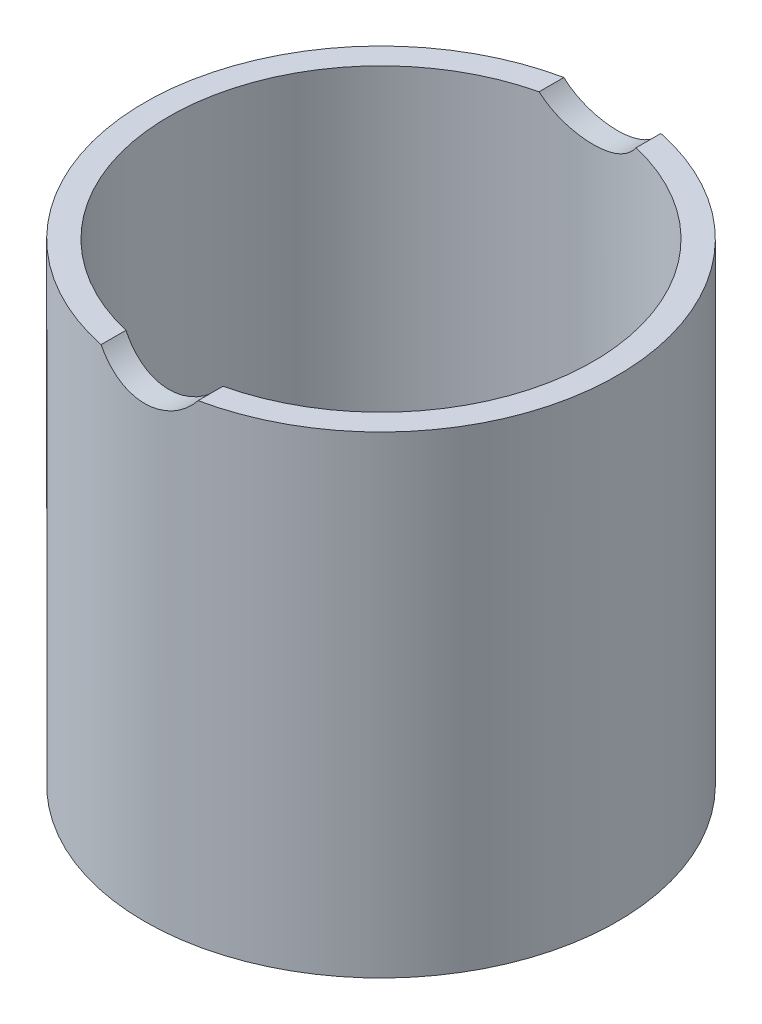
ISO-10303-21;
HEADER;
FILE_DESCRIPTION(('STEP AP214'),'2;1');
FILE_NAME('part.step','',(''),(''),'','','');
FILE_SCHEMA(('AUTOMOTIVE_DESIGN { 1 0 10303 214 1 1 1 1 }'));
ENDSEC;
DATA;
#1=APPLICATION_CONTEXT('core data for automotive mechanical design processes');
#2=APPLICATION_PROTOCOL_DEFINITION('international standard','automotive_design',2000,#1);
#3=PRODUCT_CONTEXT('',#1,'mechanical');
#4=PRODUCT('Part','Part','',(#3));
#5=PRODUCT_RELATED_PRODUCT_CATEGORY('part','',(#4));
#6=PRODUCT_DEFINITION_FORMATION('','',#4);
#7=PRODUCT_DEFINITION_CONTEXT('part definition',#1,'design');
#8=PRODUCT_DEFINITION('design','',#6,#7);
#9=PRODUCT_DEFINITION_SHAPE('','',#8);
#10=(LENGTH_UNIT() NAMED_UNIT(*) SI_UNIT(.MILLI.,.METRE.));
#11=(NAMED_UNIT(*) PLANE_ANGLE_UNIT() SI_UNIT($,.RADIAN.));
#12=(NAMED_UNIT(*) SI_UNIT($,.STERADIAN.) SOLID_ANGLE_UNIT());
#13=UNCERTAINTY_MEASURE_WITH_UNIT(LENGTH_MEASURE(1.E-05),#10,'distance_accuracy_value','');
#14=(GEOMETRIC_REPRESENTATION_CONTEXT(3) GLOBAL_UNCERTAINTY_ASSIGNED_CONTEXT((#13)) GLOBAL_UNIT_ASSIGNED_CONTEXT((#10,
#11,#12)) REPRESENTATION_CONTEXT('',''));
#15=CARTESIAN_POINT('',(0.,0.,0.));
#16=DIRECTION('',(0.,0.,1.));
#17=DIRECTION('',(1.,0.,0.));
#18=AXIS2_PLACEMENT_3D('',#15,#16,#17);
#19=CARTESIAN_POINT('',(0.,37.,0.));
#20=DIRECTION('',(0.,1.,0.));
#21=DIRECTION('',(0.,0.,1.));
#22=AXIS2_PLACEMENT_3D('',#19,#20,#21);
#23=PLANE('',#22);
#24=DIRECTION('',(0.,0.,1.));
#25=VECTOR('',#24,1.);
#26=CARTESIAN_POINT('',(-4.,37.,-19.5));
#27=LINE('',#26,#25);
#28=CARTESIAN_POINT('',(-4.,37.,-19.0853346839923));
#29=VERTEX_POINT('',#28);
#30=CARTESIAN_POINT('',(-4.,37.,-17.0367250374008));
#31=VERTEX_POINT('',#30);
#32=EDGE_CURVE('E62',#29,#31,#27,.T.);
#33=ORIENTED_EDGE('',*,*,#32,.F.);
#34=CARTESIAN_POINT('',(0.,37.,0.));
#35=DIRECTION('',(0.,1.,0.));
#36=DIRECTION('',(0.,0.,1.));
#37=AXIS2_PLACEMENT_3D('',#34,#35,#36);
#38=CIRCLE('',#37,19.5);
#39=CARTESIAN_POINT('',(-4.,37.,19.0853346839923));
#40=VERTEX_POINT('',#39);
#41=EDGE_CURVE('E105',#29,#40,#38,.T.);
#42=ORIENTED_EDGE('',*,*,#41,.T.);
#43=CARTESIAN_POINT('',(-4.,37.,17.0367250374008));
#44=VERTEX_POINT('',#43);
#45=EDGE_CURVE('E147',#44,#40,#27,.T.);
#46=ORIENTED_EDGE('',*,*,#45,.F.);
#47=CARTESIAN_POINT('',(0.,37.,0.));
#48=DIRECTION('',(0.,1.,0.));
#49=DIRECTION('',(0.,0.,1.));
#50=AXIS2_PLACEMENT_3D('',#47,#48,#49);
#51=CIRCLE('',#50,17.5);
#52=EDGE_CURVE('E106',#31,#44,#51,.T.);
#53=ORIENTED_EDGE('',*,*,#52,.F.);
#54=EDGE_LOOP('',(#33,#42,#46,#53));
#55=FACE_BOUND('',#54,.T.);
#56=ADVANCED_FACE('F39',(#55),#23,.T.);
#57=DIRECTION('',(0.,0.,1.));
#58=VECTOR('',#57,1.);
#59=CARTESIAN_POINT('',(4.,37.,-19.5));
#60=LINE('',#59,#58);
#61=CARTESIAN_POINT('',(4.,37.,19.0853346839923));
#62=VERTEX_POINT('',#61);
#63=CARTESIAN_POINT('',(4.,37.,17.0367250374008));
#64=VERTEX_POINT('',#63);
#65=EDGE_CURVE('E69',#62,#64,#60,.F.);
#66=ORIENTED_EDGE('',*,*,#65,.F.);
#67=CARTESIAN_POINT('',(4.,37.,-19.0853346839923));
#68=VERTEX_POINT('',#67);
#69=EDGE_CURVE('E94',#62,#68,#38,.T.);
#70=ORIENTED_EDGE('',*,*,#69,.T.);
#71=CARTESIAN_POINT('',(4.,37.,-17.0367250374008));
#72=VERTEX_POINT('',#71);
#73=EDGE_CURVE('E87',#72,#68,#60,.F.);
#74=ORIENTED_EDGE('',*,*,#73,.F.);
#75=EDGE_CURVE('E98',#64,#72,#51,.T.);
#76=ORIENTED_EDGE('',*,*,#75,.F.);
#77=EDGE_LOOP('',(#66,#70,#74,#76));
#78=FACE_BOUND('',#77,.T.);
#79=ADVANCED_FACE('F97',(#78),#23,.T.);
#80=CARTESIAN_POINT('',(0.,37.,0.));
#81=DIRECTION('',(0.,-1.,0.));
#82=DIRECTION('',(0.,0.,-1.));
#83=AXIS2_PLACEMENT_3D('',#80,#81,#82);
#84=CYLINDRICAL_SURFACE('',#83,19.5);
#85=ORIENTED_EDGE('',*,*,#69,.F.);
#86=CARTESIAN_POINT('',(4.,37.,19.0853346839923));
#87=CARTESIAN_POINT('',(3.91539894775833,36.887180005843,19.1030669430456));
#88=CARTESIAN_POINT('',(3.82604102713981,36.7779967337988,19.1212069531428));
#89=CARTESIAN_POINT('',(3.63845855582068,36.5675877414145,19.1577852748252));
#90=CARTESIAN_POINT('',(3.5402340828802,36.4663619513015,19.1762235837931));
#91=CARTESIAN_POINT('',(3.33552092436946,36.2725091357425,19.2128893661344));
#92=CARTESIAN_POINT('',(3.22902876900015,36.1798857567827,19.2311167472573));
#93=CARTESIAN_POINT('',(3.00852381599954,36.0039171020588,19.2668434292355));
#94=CARTESIAN_POINT('',(2.89451114468932,35.9205716705174,19.2843427423121));
#95=CARTESIAN_POINT('',(2.6596462795366,35.7637001404132,19.3181356147717));
#96=CARTESIAN_POINT('',(2.53878996285056,35.6901800525275,19.3344284333863));
#97=CARTESIAN_POINT('',(2.29106960070109,35.5535389675982,19.365344906995));
#98=CARTESIAN_POINT('',(2.16420335895805,35.4904218105596,19.3799679450186));
#99=CARTESIAN_POINT('',(1.9055042771648,35.3751663432857,19.4071108284061));
#100=CARTESIAN_POINT('',(1.77367625169066,35.323017698041,19.4196326513561));
#101=CARTESIAN_POINT('',(1.5058290948625,35.2300333403227,19.4422361236066));
#102=CARTESIAN_POINT('',(1.36980848126281,35.1892016810313,19.4523168984821));
#103=CARTESIAN_POINT('',(1.09689156804576,35.119802686935,19.4695971865778));
#104=CARTESIAN_POINT('',(0.960046711404564,35.0910441834348,19.4768414783258));
#105=CARTESIAN_POINT('',(0.684257723726504,35.0450690103063,19.4884798077338));
#106=CARTESIAN_POINT('',(0.545312836119357,35.0278566068344,19.4928727918477));
#107=CARTESIAN_POINT('',(0.266450925840192,35.0051458715094,19.4986780826447));
#108=CARTESIAN_POINT('',(0.12653422385814,34.9996438439155,19.5000913297178));
#109=CARTESIAN_POINT('',(-0.15331759407486,35.000392023477,19.4998994735274));
#110=CARTESIAN_POINT('',(-0.293252698157859,35.006646513713,19.4982932702315));
#111=CARTESIAN_POINT('',(-0.568598778598844,35.0305615124071,19.492182794488));
#112=CARTESIAN_POINT('',(-0.704036223140041,35.0479369445756,19.4877509652917));
#113=CARTESIAN_POINT('',(-0.972971800120385,35.0936836706468,19.4761765073741));
#114=CARTESIAN_POINT('',(-1.1064692073115,35.122058972251,19.4690328906577));
#115=CARTESIAN_POINT('',(-1.37051970547725,35.1895703736207,19.4522276995979));
#116=CARTESIAN_POINT('',(-1.50107359965313,35.2287034984693,19.4425668214044));
#117=CARTESIAN_POINT('',(-1.75840501498859,35.3174190335291,19.4209867885127));
#118=CARTESIAN_POINT('',(-1.88518116512297,35.3670051859009,19.4090668252219));
#119=CARTESIAN_POINT('',(-2.26051630269412,35.5317803583803,19.3701684494768));
#120=CARTESIAN_POINT('',(-2.50215016063253,35.6624903317992,19.340181018449));
#121=CARTESIAN_POINT('',(-2.96017235689538,35.9611720026755,19.2753991602963));
#122=CARTESIAN_POINT('',(-3.17657490974579,36.129122563673,19.2406074641138));
#123=CARTESIAN_POINT('',(-3.49185785247516,36.4179690027493,19.1851614477263));
#124=CARTESIAN_POINT('',(-3.60110428143892,36.527824022388,19.164896786588));
#125=CARTESIAN_POINT('',(-3.80877699730753,36.7569947049788,19.1247057123629));
#126=CARTESIAN_POINT('',(-3.90722342917271,36.8762920141025,19.1047787302355));
#127=CARTESIAN_POINT('',(-4.,37.,19.0853346839923));
#128=B_SPLINE_CURVE_WITH_KNOTS('',3,(#86,#87,#88,#89,#90,#91,#92,#93,#94,#95,#96,#97,#98,#99,
#100,#101,#102,#103,#104,#105,#106,#107,#108,#109,#110,#111,#112,#113,#114,#115,#116,#117,#118,
#119,#120,#121,#122,#123,#124,#125,#126,#127),.UNSPECIFIED.,.F.,.F.,(4,2,2,2,2,2,2,2,2,2,2,2,2,
2,2,2,2,2,2,2,4),(0.,0.426250026635663,0.852496315399733,1.27892246934025,1.70534146248273,
2.13202013584765,2.55885595688901,2.98528777486733,3.4118721227591,3.83142080794221,
4.25112442646869,4.67069556880661,5.09041959700064,5.49979321535186,5.90931612561346,
6.31872590208709,6.72828249601786,7.55331763757749,8.37788571109845,8.84603127885557,
9.31328822172199),.UNSPECIFIED.);
#129=EDGE_CURVE('E141',#62,#40,#128,.T.);
#130=ORIENTED_EDGE('',*,*,#129,.T.);
#131=ORIENTED_EDGE('',*,*,#41,.F.);
#132=CARTESIAN_POINT('',(-4.,37.,-19.0853346839923));
#133=CARTESIAN_POINT('',(-3.91539894775833,36.887180005843,-19.1030669430456));
#134=CARTESIAN_POINT('',(-3.82604102713981,36.7779967337988,-19.1212069531428));
#135=CARTESIAN_POINT('',(-3.63845855582068,36.5675877414145,-19.1577852748252));
#136=CARTESIAN_POINT('',(-3.5402340828802,36.4663619513015,-19.1762235837931));
#137=CARTESIAN_POINT('',(-3.33552092436946,36.2725091357425,-19.2128893661344));
#138=CARTESIAN_POINT('',(-3.22902876900015,36.1798857567827,-19.2311167472573));
#139=CARTESIAN_POINT('',(-3.00852381599954,36.0039171020588,-19.2668434292355));
#140=CARTESIAN_POINT('',(-2.89451114468932,35.9205716705174,-19.2843427423121));
#141=CARTESIAN_POINT('',(-2.6596462795366,35.7637001404132,-19.3181356147717));
#142=CARTESIAN_POINT('',(-2.53878996285056,35.6901800525275,-19.3344284333863));
#143=CARTESIAN_POINT('',(-2.29106960070109,35.5535389675982,-19.365344906995));
#144=CARTESIAN_POINT('',(-2.16420335895805,35.4904218105596,-19.3799679450186));
#145=CARTESIAN_POINT('',(-1.9055042771648,35.3751663432857,-19.4071108284061));
#146=CARTESIAN_POINT('',(-1.77367625169066,35.323017698041,-19.4196326513561));
#147=CARTESIAN_POINT('',(-1.5058290948625,35.2300333403227,-19.4422361236066));
#148=CARTESIAN_POINT('',(-1.36980848126281,35.1892016810313,-19.4523168984821));
#149=CARTESIAN_POINT('',(-1.09689156804576,35.119802686935,-19.4695971865778));
#150=CARTESIAN_POINT('',(-0.960046711404564,35.0910441834348,-19.4768414783258));
#151=CARTESIAN_POINT('',(-0.684257723726504,35.0450690103063,-19.4884798077338));
#152=CARTESIAN_POINT('',(-0.545312836119357,35.0278566068344,-19.4928727918477));
#153=CARTESIAN_POINT('',(-0.266450925840192,35.0051458715094,-19.4986780826447));
#154=CARTESIAN_POINT('',(-0.12653422385814,34.9996438439155,-19.5000913297178));
#155=CARTESIAN_POINT('',(0.15331759407486,35.000392023477,-19.4998994735274));
#156=CARTESIAN_POINT('',(0.293252698157859,35.006646513713,-19.4982932702315));
#157=CARTESIAN_POINT('',(0.568598778598844,35.0305615124071,-19.492182794488));
#158=CARTESIAN_POINT('',(0.704036223140041,35.0479369445756,-19.4877509652917));
#159=CARTESIAN_POINT('',(0.972971800120385,35.0936836706468,-19.4761765073741));
#160=CARTESIAN_POINT('',(1.1064692073115,35.122058972251,-19.4690328906577));
#161=CARTESIAN_POINT('',(1.37051970547725,35.1895703736207,-19.4522276995979));
#162=CARTESIAN_POINT('',(1.50107359965313,35.2287034984693,-19.4425668214044));
#163=CARTESIAN_POINT('',(1.75840501498859,35.3174190335291,-19.4209867885127));
#164=CARTESIAN_POINT('',(1.88518116512297,35.3670051859009,-19.4090668252219));
#165=CARTESIAN_POINT('',(2.26051630269412,35.5317803583803,-19.3701684494768));
#166=CARTESIAN_POINT('',(2.50215016063253,35.6624903317992,-19.340181018449));
#167=CARTESIAN_POINT('',(2.96017235689538,35.9611720026755,-19.2753991602963));
#168=CARTESIAN_POINT('',(3.17657490974579,36.129122563673,-19.2406074641138));
#169=CARTESIAN_POINT('',(3.49185785247516,36.4179690027493,-19.1851614477263));
#170=CARTESIAN_POINT('',(3.60110428143892,36.527824022388,-19.164896786588));
#171=CARTESIAN_POINT('',(3.80877699730753,36.7569947049788,-19.1247057123629));
#172=CARTESIAN_POINT('',(3.90722342917271,36.8762920141025,-19.1047787302355));
#173=CARTESIAN_POINT('',(4.,37.,-19.0853346839923));
#174=B_SPLINE_CURVE_WITH_KNOTS('',3,(#132,#133,#134,#135,#136,#137,#138,#139,#140,#141,#142,
#143,#144,#145,#146,#147,#148,#149,#150,#151,#152,#153,#154,#155,#156,#157,#158,#159,#160,#161,
#162,#163,#164,#165,#166,#167,#168,#169,#170,#171,#172,#173),.UNSPECIFIED.,.F.,.F.,(4,2,2,2,2,2,
2,2,2,2,2,2,2,2,2,2,2,2,2,2,4),(0.,0.426250026635663,0.852496315399733,1.27892246934025,
1.70534146248273,2.13202013584765,2.55885595688901,2.98528777486733,3.4118721227591,
3.83142080794221,4.25112442646869,4.67069556880661,5.09041959700064,5.49979321535186,
5.90931612561346,6.31872590208709,6.72828249601786,7.55331763757749,8.37788571109845,
8.84603127885557,9.31328822172199),.UNSPECIFIED.);
#175=EDGE_CURVE('E134',#29,#68,#174,.T.);
#176=ORIENTED_EDGE('',*,*,#175,.T.);
#177=EDGE_LOOP('',(#85,#130,#131,#176));
#178=FACE_BOUND('',#177,.T.);
#179=CARTESIAN_POINT('',(0.,-2.,0.));
#180=DIRECTION('',(0.,1.,0.));
#181=DIRECTION('',(0.,0.,1.));
#182=AXIS2_PLACEMENT_3D('',#179,#180,#181);
#183=CIRCLE('',#182,19.5);
#184=CARTESIAN_POINT('',(0.,-2.,19.5));
#185=VERTEX_POINT('',#184);
#186=EDGE_CURVE('E115',#185,#185,#183,.T.);
#187=ORIENTED_EDGE('',*,*,#186,.T.);
#188=EDGE_LOOP('',(#187));
#189=FACE_BOUND('',#188,.T.);
#190=ADVANCED_FACE('F41',(#178,#189),#84,.T.);
#191=CARTESIAN_POINT('',(0.,37.,0.));
#192=DIRECTION('',(0.,-1.,0.));
#193=DIRECTION('',(0.,0.,-1.));
#194=AXIS2_PLACEMENT_3D('',#191,#192,#193);
#195=CYLINDRICAL_SURFACE('',#194,17.5);
#196=CARTESIAN_POINT('',(4.,37.,17.0367250374008));
#197=CARTESIAN_POINT('',(3.91534408547769,36.887108519543,17.0566026049032));
#198=CARTESIAN_POINT('',(3.82593406738742,36.7778668956684,17.0769280252748));
#199=CARTESIAN_POINT('',(3.63824198187981,36.56735467786,17.1178972545212));
#200=CARTESIAN_POINT('',(3.53995989272078,36.466084103461,17.1385410641762));
#201=CARTESIAN_POINT('',(3.33508837845952,36.2721178210682,17.179584048879));
#202=CARTESIAN_POINT('',(3.22849317156432,36.1794281809118,17.199983042071));
#203=CARTESIAN_POINT('',(3.00775025327004,36.0033301094883,17.2399540651222));
#204=CARTESIAN_POINT('',(2.89360268114253,35.9199215071475,17.2595261102202));
#205=CARTESIAN_POINT('',(2.65841295642604,35.7629201818731,17.2973128997897));
#206=CARTESIAN_POINT('',(2.5373660511577,35.6893343449779,17.3155266881777));
#207=CARTESIAN_POINT('',(2.28920906510931,35.5525738166661,17.3500783497773));
#208=CARTESIAN_POINT('',(2.16209676849294,35.4894029682338,17.3664155298756));
#209=CARTESIAN_POINT('',(1.90285892247035,35.3740695046664,17.3967278155374));
#210=CARTESIAN_POINT('',(1.77073874271922,35.3218954714029,17.4107053680985));
#211=CARTESIAN_POINT('',(1.50225166976644,35.2288964262533,17.4359233606619));
#212=CARTESIAN_POINT('',(1.36588328706513,35.1880754459157,17.4471628281757));
#213=CARTESIAN_POINT('',(1.09278921402777,35.1188890103472,17.4663723349887));
#214=CARTESIAN_POINT('',(0.9561283220398,35.0902850735081,17.4744047519008));
#215=CARTESIAN_POINT('',(0.680693535465125,35.0445836952957,17.4873002152181));
#216=CARTESIAN_POINT('',(0.541918879639333,35.0274905045677,17.4921620907966));
#217=CARTESIAN_POINT('',(0.263395428208653,35.0049887972994,17.4985719522242));
#218=CARTESIAN_POINT('',(0.123646971726404,34.999576398822,17.5001210390276));
#219=CARTESIAN_POINT('',(-0.15586109794494,35.0004754886971,17.4998641359983));
#220=CARTESIAN_POINT('',(-0.295620696717879,35.00679124022,17.4980569261552));
#221=CARTESIAN_POINT('',(-0.569843611928941,35.0307296921787,17.4912412797191));
#222=CARTESIAN_POINT('',(-0.704339726904509,35.0480063464405,17.4863308331185));
#223=CARTESIAN_POINT('',(-0.971394117660786,35.0933976030916,17.4735306667096));
#224=CARTESIAN_POINT('',(-1.10395167318487,35.1215161325853,17.46563986739));
#225=CARTESIAN_POINT('',(-1.36613524242317,35.1883512246057,17.4470894822062));
#226=CARTESIAN_POINT('',(-1.49576207276449,35.2270647944906,17.4364306782272));
#227=CARTESIAN_POINT('',(-1.75126945544137,35.3147754334478,17.4126265010489));
#228=CARTESIAN_POINT('',(-1.87714864032039,35.3637762048961,17.3994802327769));
#229=CARTESIAN_POINT('',(-2.2502827124866,35.5267201840124,17.3565283937621));
#230=CARTESIAN_POINT('',(-2.49065460168873,35.6559962217144,17.3233868353747));
#231=CARTESIAN_POINT('',(-2.9464875983623,35.9512995262601,17.2517123626032));
#232=CARTESIAN_POINT('',(-3.16196070070729,36.1173089836473,17.2131820641604));
#233=CARTESIAN_POINT('',(-3.4795701672035,36.4058816482888,17.151002748727));
#234=CARTESIAN_POINT('',(-3.59160046279972,36.5178395143285,17.127821958019));
#235=CARTESIAN_POINT('',(-3.80437923808022,36.7516713240746,17.0818182672155));
#236=CARTESIAN_POINT('',(-3.90514897494327,36.8735258075326,17.0589947651988));
#237=CARTESIAN_POINT('',(-4.,37.,17.0367250374008));
#238=B_SPLINE_CURVE_WITH_KNOTS('',3,(#196,#197,#198,#199,#200,#201,#202,#203,#204,#205,#206,
#207,#208,#209,#210,#211,#212,#213,#214,#215,#216,#217,#218,#219,#220,#221,#222,#223,#224,#225,
#226,#227,#228,#229,#230,#231,#232,#233,#234,#235,#236,#237),.UNSPECIFIED.,.F.,.F.,(4,2,2,2,2,2,
2,2,2,2,2,2,2,2,2,2,2,2,2,2,4),(0.,0.427367943901694,0.854736935129296,1.28240585971255,
1.71006689994097,2.13802618567936,2.56614303066559,2.99381314268303,3.42163493000333,
3.84067453057113,4.25986878778439,4.67892371056639,5.09813098919158,5.50472067115337,
5.91145776510404,6.31808009173385,6.72484901386548,7.54568410308246,8.36612209558687,
8.84569116127194,9.32433905304124),.UNSPECIFIED.);
#239=EDGE_CURVE('E11',#64,#44,#238,.T.);
#240=ORIENTED_EDGE('',*,*,#239,.F.);
#241=ORIENTED_EDGE('',*,*,#75,.T.);
#242=CARTESIAN_POINT('',(-4.,37.,-17.0367250374008));
#243=CARTESIAN_POINT('',(-3.91534408547769,36.887108519543,-17.0566026049032));
#244=CARTESIAN_POINT('',(-3.82593406738742,36.7778668956684,-17.0769280252748));
#245=CARTESIAN_POINT('',(-3.63824198187981,36.56735467786,-17.1178972545212));
#246=CARTESIAN_POINT('',(-3.53995989272078,36.466084103461,-17.1385410641762));
#247=CARTESIAN_POINT('',(-3.33508837845952,36.2721178210682,-17.179584048879));
#248=CARTESIAN_POINT('',(-3.22849317156432,36.1794281809118,-17.199983042071));
#249=CARTESIAN_POINT('',(-3.00775025327004,36.0033301094883,-17.2399540651222));
#250=CARTESIAN_POINT('',(-2.89360268114253,35.9199215071475,-17.2595261102202));
#251=CARTESIAN_POINT('',(-2.65841295642604,35.7629201818731,-17.2973128997897));
#252=CARTESIAN_POINT('',(-2.5373660511577,35.6893343449779,-17.3155266881777));
#253=CARTESIAN_POINT('',(-2.28920906510931,35.5525738166661,-17.3500783497773));
#254=CARTESIAN_POINT('',(-2.16209676849294,35.4894029682338,-17.3664155298756));
#255=CARTESIAN_POINT('',(-1.90285892247035,35.3740695046664,-17.3967278155374));
#256=CARTESIAN_POINT('',(-1.77073874271922,35.3218954714029,-17.4107053680985));
#257=CARTESIAN_POINT('',(-1.50225166976644,35.2288964262533,-17.4359233606619));
#258=CARTESIAN_POINT('',(-1.36588328706513,35.1880754459157,-17.4471628281757));
#259=CARTESIAN_POINT('',(-1.09278921402777,35.1188890103472,-17.4663723349887));
#260=CARTESIAN_POINT('',(-0.9561283220398,35.0902850735081,-17.4744047519008));
#261=CARTESIAN_POINT('',(-0.680693535465125,35.0445836952957,-17.4873002152181));
#262=CARTESIAN_POINT('',(-0.541918879639333,35.0274905045677,-17.4921620907966));
#263=CARTESIAN_POINT('',(-0.263395428208653,35.0049887972994,-17.4985719522242));
#264=CARTESIAN_POINT('',(-0.123646971726404,34.999576398822,-17.5001210390276));
#265=CARTESIAN_POINT('',(0.15586109794494,35.0004754886971,-17.4998641359983));
#266=CARTESIAN_POINT('',(0.295620696717879,35.00679124022,-17.4980569261552));
#267=CARTESIAN_POINT('',(0.569843611928941,35.0307296921787,-17.4912412797191));
#268=CARTESIAN_POINT('',(0.704339726904509,35.0480063464405,-17.4863308331185));
#269=CARTESIAN_POINT('',(0.971394117660786,35.0933976030916,-17.4735306667096));
#270=CARTESIAN_POINT('',(1.10395167318487,35.1215161325853,-17.46563986739));
#271=CARTESIAN_POINT('',(1.36613524242317,35.1883512246057,-17.4470894822062));
#272=CARTESIAN_POINT('',(1.49576207276449,35.2270647944906,-17.4364306782272));
#273=CARTESIAN_POINT('',(1.75126945544137,35.3147754334478,-17.4126265010489));
#274=CARTESIAN_POINT('',(1.87714864032039,35.3637762048961,-17.3994802327769));
#275=CARTESIAN_POINT('',(2.2502827124866,35.5267201840124,-17.3565283937621));
#276=CARTESIAN_POINT('',(2.49065460168873,35.6559962217144,-17.3233868353747));
#277=CARTESIAN_POINT('',(2.9464875983623,35.9512995262601,-17.2517123626032));
#278=CARTESIAN_POINT('',(3.16196070070729,36.1173089836473,-17.2131820641604));
#279=CARTESIAN_POINT('',(3.4795701672035,36.4058816482888,-17.151002748727));
#280=CARTESIAN_POINT('',(3.59160046279972,36.5178395143285,-17.127821958019));
#281=CARTESIAN_POINT('',(3.80437923808022,36.7516713240746,-17.0818182672155));
#282=CARTESIAN_POINT('',(3.90514897494327,36.8735258075326,-17.0589947651988));
#283=CARTESIAN_POINT('',(4.,37.,-17.0367250374008));
#284=B_SPLINE_CURVE_WITH_KNOTS('',3,(#242,#243,#244,#245,#246,#247,#248,#249,#250,#251,#252,
#253,#254,#255,#256,#257,#258,#259,#260,#261,#262,#263,#264,#265,#266,#267,#268,#269,#270,#271,
#272,#273,#274,#275,#276,#277,#278,#279,#280,#281,#282,#283),.UNSPECIFIED.,.F.,.F.,(4,2,2,2,2,2,
2,2,2,2,2,2,2,2,2,2,2,2,2,2,4),(0.,0.427367943901694,0.854736935129296,1.28240585971255,
1.71006689994097,2.13802618567936,2.56614303066559,2.99381314268303,3.42163493000333,
3.84067453057113,4.25986878778439,4.67892371056639,5.09813098919158,5.50472067115337,
5.91145776510404,6.31808009173385,6.72484901386548,7.54568410308246,8.36612209558687,
8.84569116127194,9.32433905304124),.UNSPECIFIED.);
#285=EDGE_CURVE('E55',#31,#72,#284,.T.);
#286=ORIENTED_EDGE('',*,*,#285,.F.);
#287=ORIENTED_EDGE('',*,*,#52,.T.);
#288=EDGE_LOOP('',(#240,#241,#286,#287));
#289=FACE_BOUND('',#288,.T.);
#290=CARTESIAN_POINT('',(0.,0.,0.));
#291=DIRECTION('',(0.,1.,0.));
#292=DIRECTION('',(0.,0.,1.));
#293=AXIS2_PLACEMENT_3D('',#290,#291,#292);
#294=CIRCLE('',#293,17.5);
#295=CARTESIAN_POINT('',(0.,0.,17.5));
#296=VERTEX_POINT('',#295);
#297=EDGE_CURVE('E112',#296,#296,#294,.T.);
#298=ORIENTED_EDGE('',*,*,#297,.F.);
#299=EDGE_LOOP('',(#298));
#300=FACE_BOUND('',#299,.T.);
#301=ADVANCED_FACE('F102',(#289,#300),#195,.F.);
#302=CARTESIAN_POINT('',(0.,0.,0.));
#303=DIRECTION('',(0.,1.,0.));
#304=DIRECTION('',(0.,0.,1.));
#305=AXIS2_PLACEMENT_3D('',#302,#303,#304);
#306=PLANE('',#305);
#307=ORIENTED_EDGE('',*,*,#297,.T.);
#308=EDGE_LOOP('',(#307));
#309=FACE_BOUND('',#308,.T.);
#310=ADVANCED_FACE('F164',(#309),#306,.T.);
#311=CARTESIAN_POINT('',(0.,-2.,0.));
#312=DIRECTION('',(0.,1.,0.));
#313=DIRECTION('',(0.,0.,1.));
#314=AXIS2_PLACEMENT_3D('',#311,#312,#313);
#315=PLANE('',#314);
#316=ORIENTED_EDGE('',*,*,#186,.F.);
#317=EDGE_LOOP('',(#316));
#318=FACE_BOUND('',#317,.T.);
#319=ADVANCED_FACE('F129',(#318),#315,.F.);
#320=CARTESIAN_POINT('',(0.,40.,-19.5));
#321=DIRECTION('',(0.,0.,1.));
#322=DIRECTION('',(1.,0.,0.));
#323=AXIS2_PLACEMENT_3D('',#320,#321,#322);
#324=CYLINDRICAL_SURFACE('',#323,5.);
#325=ORIENTED_EDGE('',*,*,#32,.T.);
#326=ORIENTED_EDGE('',*,*,#285,.T.);
#327=ORIENTED_EDGE('',*,*,#73,.T.);
#328=ORIENTED_EDGE('',*,*,#175,.F.);
#329=EDGE_LOOP('',(#325,#326,#327,#328));
#330=FACE_BOUND('',#329,.T.);
#331=ADVANCED_FACE('F86',(#330),#324,.F.);
#332=ORIENTED_EDGE('',*,*,#65,.T.);
#333=ORIENTED_EDGE('',*,*,#239,.T.);
#334=ORIENTED_EDGE('',*,*,#45,.T.);
#335=ORIENTED_EDGE('',*,*,#129,.F.);
#336=EDGE_LOOP('',(#332,#333,#334,#335));
#337=FACE_BOUND('',#336,.T.);
#338=ADVANCED_FACE('F125',(#337),#324,.F.);
#339=CLOSED_SHELL('',(#56,#79,#190,#301,#310,#319,#331,#338));
#340=MANIFOLD_SOLID_BREP('B2',#339);
#341=ADVANCED_BREP_SHAPE_REPRESENTATION('',(#18,#340),#14);
#342=SHAPE_DEFINITION_REPRESENTATION(#9,#341);
ENDSEC;
END-ISO-10303-21;
